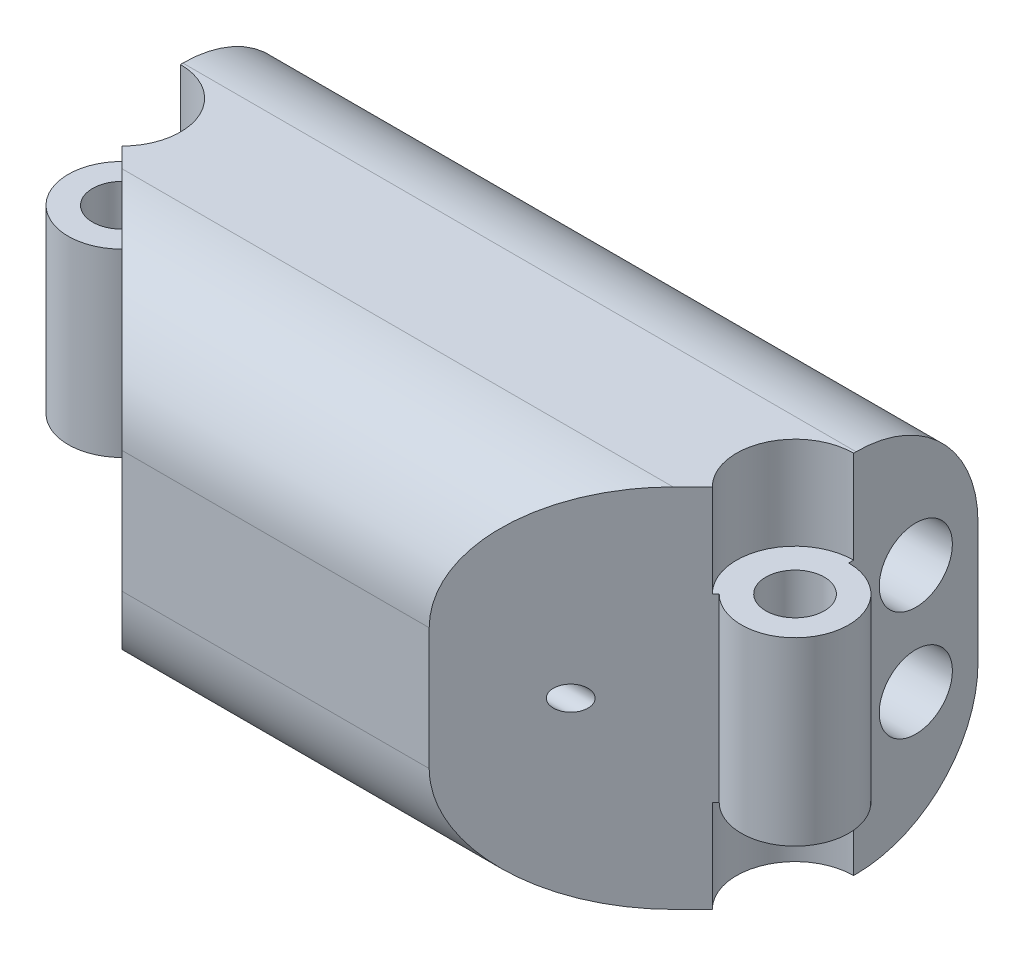
ISO-10303-21;
HEADER;
FILE_DESCRIPTION(('STEP AP214'),'2;1');
FILE_NAME('part.step','',(''),(''),'','','');
FILE_SCHEMA(('AUTOMOTIVE_DESIGN { 1 0 10303 214 1 1 1 1 }'));
ENDSEC;
DATA;
#1=APPLICATION_CONTEXT('core data for automotive mechanical design processes');
#2=APPLICATION_PROTOCOL_DEFINITION('international standard','automotive_design',2000,#1);
#3=PRODUCT_CONTEXT('',#1,'mechanical');
#4=PRODUCT('Part','Part','',(#3));
#5=PRODUCT_RELATED_PRODUCT_CATEGORY('part','',(#4));
#6=PRODUCT_DEFINITION_FORMATION('','',#4);
#7=PRODUCT_DEFINITION_CONTEXT('part definition',#1,'design');
#8=PRODUCT_DEFINITION('design','',#6,#7);
#9=PRODUCT_DEFINITION_SHAPE('','',#8);
#10=(LENGTH_UNIT() NAMED_UNIT(*) SI_UNIT(.MILLI.,.METRE.));
#11=(NAMED_UNIT(*) PLANE_ANGLE_UNIT() SI_UNIT($,.RADIAN.));
#12=(NAMED_UNIT(*) SI_UNIT($,.STERADIAN.) SOLID_ANGLE_UNIT());
#13=UNCERTAINTY_MEASURE_WITH_UNIT(LENGTH_MEASURE(1.E-05),#10,'distance_accuracy_value','');
#14=(GEOMETRIC_REPRESENTATION_CONTEXT(3) GLOBAL_UNCERTAINTY_ASSIGNED_CONTEXT((#13)) GLOBAL_UNIT_ASSIGNED_CONTEXT((#10,
#11,#12)) REPRESENTATION_CONTEXT('',''));
#15=CARTESIAN_POINT('',(0.,0.,0.));
#16=DIRECTION('',(0.,0.,1.));
#17=DIRECTION('',(1.,0.,0.));
#18=AXIS2_PLACEMENT_3D('',#15,#16,#17);
#19=CARTESIAN_POINT('',(13.8,-7.5,0.));
#20=DIRECTION('',(0.,1.,0.));
#21=DIRECTION('',(0.,0.,1.));
#22=AXIS2_PLACEMENT_3D('',#19,#20,#21);
#23=CYLINDRICAL_SURFACE('',#22,2.4);
#24=CARTESIAN_POINT('',(13.8,-3.7,0.));
#25=DIRECTION('',(0.,1.,0.));
#26=DIRECTION('',(0.,0.,1.));
#27=AXIS2_PLACEMENT_3D('',#24,#25,#26);
#28=CIRCLE('',#27,2.4);
#29=CARTESIAN_POINT('',(13.8,-3.7,-2.4));
#30=VERTEX_POINT('',#29);
#31=CARTESIAN_POINT('',(12.1029437251523,-3.7,1.69705627484771));
#32=VERTEX_POINT('',#31);
#33=EDGE_CURVE('E71',#30,#32,#28,.T.);
#34=ORIENTED_EDGE('',*,*,#33,.T.);
#35=DIRECTION('',(0.,1.,0.));
#36=VECTOR('',#35,1.);
#37=CARTESIAN_POINT('',(12.1029437251523,-7.5,1.69705627484771));
#38=LINE('',#37,#36);
#39=CARTESIAN_POINT('',(12.1029437251523,-7.5,1.69705627484771));
#40=VERTEX_POINT('',#39);
#41=EDGE_CURVE('E349',#40,#32,#38,.T.);
#42=ORIENTED_EDGE('',*,*,#41,.F.);
#43=CARTESIAN_POINT('',(13.8,-7.5,0.));
#44=DIRECTION('',(0.,1.,0.));
#45=DIRECTION('',(0.,0.,1.));
#46=AXIS2_PLACEMENT_3D('',#43,#44,#45);
#47=CIRCLE('',#46,2.4);
#48=CARTESIAN_POINT('',(13.8,-7.5,-2.4));
#49=VERTEX_POINT('',#48);
#50=EDGE_CURVE('E327',#49,#40,#47,.T.);
#51=ORIENTED_EDGE('',*,*,#50,.F.);
#52=DIRECTION('',(0.,1.,0.));
#53=VECTOR('',#52,1.);
#54=CARTESIAN_POINT('',(13.8,-7.5,-2.4));
#55=LINE('',#54,#53);
#56=EDGE_CURVE('E379',#49,#30,#55,.T.);
#57=ORIENTED_EDGE('',*,*,#56,.T.);
#58=EDGE_LOOP('',(#34,#42,#51,#57));
#59=FACE_BOUND('',#58,.T.);
#60=ADVANCED_FACE('F47',(#59),#23,.F.);
#61=CARTESIAN_POINT('',(-13.8,-7.5,0.));
#62=DIRECTION('',(0.,1.,0.));
#63=DIRECTION('',(0.,0.,1.));
#64=AXIS2_PLACEMENT_3D('',#61,#62,#63);
#65=CYLINDRICAL_SURFACE('',#64,2.4);
#66=CARTESIAN_POINT('',(-13.8,3.7,0.));
#67=DIRECTION('',(0.,1.,0.));
#68=DIRECTION('',(0.,0.,-1.));
#69=AXIS2_PLACEMENT_3D('',#66,#67,#68);
#70=CIRCLE('',#69,2.4);
#71=CARTESIAN_POINT('',(-12.1029437251523,3.7,1.69705627484772));
#72=VERTEX_POINT('',#71);
#73=CARTESIAN_POINT('',(-13.8,3.7,-2.4));
#74=VERTEX_POINT('',#73);
#75=EDGE_CURVE('E274',#72,#74,#70,.T.);
#76=ORIENTED_EDGE('',*,*,#75,.F.);
#77=DIRECTION('',(0.,1.,0.));
#78=VECTOR('',#77,1.);
#79=CARTESIAN_POINT('',(-12.1029437251523,-7.5,1.69705627484771));
#80=LINE('',#79,#78);
#81=CARTESIAN_POINT('',(-12.1029437251523,7.5,1.69705627484771));
#82=VERTEX_POINT('',#81);
#83=EDGE_CURVE('E365',#72,#82,#80,.T.);
#84=ORIENTED_EDGE('',*,*,#83,.T.);
#85=CARTESIAN_POINT('',(-13.8,7.5,0.));
#86=DIRECTION('',(0.,1.,0.));
#87=DIRECTION('',(0.,0.,1.));
#88=AXIS2_PLACEMENT_3D('',#85,#86,#87);
#89=CIRCLE('',#88,2.4);
#90=CARTESIAN_POINT('',(-13.8,7.5,-2.4));
#91=VERTEX_POINT('',#90);
#92=EDGE_CURVE('E316',#82,#91,#89,.T.);
#93=ORIENTED_EDGE('',*,*,#92,.T.);
#94=DIRECTION('',(0.,1.,0.));
#95=VECTOR('',#94,1.);
#96=CARTESIAN_POINT('',(-13.8,-7.5,-2.4));
#97=LINE('',#96,#95);
#98=EDGE_CURVE('E370',#74,#91,#97,.T.);
#99=ORIENTED_EDGE('',*,*,#98,.F.);
#100=EDGE_LOOP('',(#76,#84,#93,#99));
#101=FACE_BOUND('',#100,.T.);
#102=ADVANCED_FACE('F449',(#101),#65,.F.);
#103=CARTESIAN_POINT('',(12.1029437251523,3.7,1.69705627484771));
#104=VERTEX_POINT('',#103);
#105=CARTESIAN_POINT('',(12.1029437251523,7.5,1.69705627484771));
#106=VERTEX_POINT('',#105);
#107=EDGE_CURVE('E63',#104,#106,#38,.T.);
#108=ORIENTED_EDGE('',*,*,#107,.F.);
#109=CARTESIAN_POINT('',(13.8,3.7,0.));
#110=DIRECTION('',(0.,1.,0.));
#111=DIRECTION('',(0.,0.,1.));
#112=AXIS2_PLACEMENT_3D('',#109,#110,#111);
#113=CIRCLE('',#112,2.4);
#114=CARTESIAN_POINT('',(13.8,3.7,-2.4));
#115=VERTEX_POINT('',#114);
#116=EDGE_CURVE('E209',#115,#104,#113,.T.);
#117=ORIENTED_EDGE('',*,*,#116,.F.);
#118=CARTESIAN_POINT('',(13.8,7.5,-2.4));
#119=VERTEX_POINT('',#118);
#120=EDGE_CURVE('E348',#115,#119,#55,.T.);
#121=ORIENTED_EDGE('',*,*,#120,.T.);
#122=CARTESIAN_POINT('',(13.8,7.5,0.));
#123=DIRECTION('',(0.,1.,0.));
#124=DIRECTION('',(0.,0.,1.));
#125=AXIS2_PLACEMENT_3D('',#122,#123,#124);
#126=CIRCLE('',#125,2.4);
#127=EDGE_CURVE('E299',#119,#106,#126,.T.);
#128=ORIENTED_EDGE('',*,*,#127,.T.);
#129=EDGE_LOOP('',(#108,#117,#121,#128));
#130=FACE_BOUND('',#129,.T.);
#131=ADVANCED_FACE('F454',(#130),#23,.F.);
#132=CARTESIAN_POINT('',(6.9,-7.5,6.9));
#133=DIRECTION('',(-0.707106781186547,0.,-0.707106781186548));
#134=DIRECTION('',(-0.707106781186548,0.,0.707106781186547));
#135=AXIS2_PLACEMENT_3D('',#132,#133,#134);
#136=PLANE('',#135);
#137=CARTESIAN_POINT('',(9.20147186257615,0.,4.59852813742385));
#138=DIRECTION('',(-0.707106781186547,0.,-0.707106781186548));
#139=DIRECTION('',(-0.707106781186548,0.,0.707106781186547));
#140=AXIS2_PLACEMENT_3D('',#137,#138,#139);
#141=ELLIPSE('',#140,0.707106781186548,0.5);
#142=CARTESIAN_POINT('',(8.70147186257615,0.,5.09852813742386));
#143=VERTEX_POINT('',#142);
#144=EDGE_CURVE('E285',#143,#143,#141,.T.);
#145=ORIENTED_EDGE('',*,*,#144,.T.);
#146=EDGE_LOOP('',(#145));
#147=FACE_BOUND('',#146,.T.);
#148=DIRECTION('',(-0.707106781186548,0.,0.707106781186547));
#149=VECTOR('',#148,1.);
#150=CARTESIAN_POINT('',(6.9,7.5,6.9));
#151=LINE('',#150,#149);
#152=CARTESIAN_POINT('',(11.3,7.5,2.5));
#153=VERTEX_POINT('',#152);
#154=EDGE_CURVE('E324',#106,#153,#151,.T.);
#155=ORIENTED_EDGE('',*,*,#154,.T.);
#156=CARTESIAN_POINT('',(11.3,2.5,2.5));
#157=DIRECTION('',(-0.707106781186547,0.,-0.707106781186548));
#158=DIRECTION('',(0.707106781186548,0.,-0.707106781186547));
#159=AXIS2_PLACEMENT_3D('',#156,#157,#158);
#160=ELLIPSE('',#159,7.07106781186548,5.);
#161=CARTESIAN_POINT('',(6.3,2.5,7.5));
#162=VERTEX_POINT('',#161);
#163=EDGE_CURVE('E56',#153,#162,#160,.F.);
#164=ORIENTED_EDGE('',*,*,#163,.T.);
#165=DIRECTION('',(0.,1.,0.));
#166=VECTOR('',#165,1.);
#167=CARTESIAN_POINT('',(6.3,-7.5,7.5));
#168=LINE('',#167,#166);
#169=CARTESIAN_POINT('',(6.3,-2.5,7.5));
#170=VERTEX_POINT('',#169);
#171=EDGE_CURVE('E353',#170,#162,#168,.T.);
#172=ORIENTED_EDGE('',*,*,#171,.F.);
#173=CARTESIAN_POINT('',(11.3,-2.5,2.5));
#174=DIRECTION('',(-0.707106781186547,0.,-0.707106781186548));
#175=DIRECTION('',(-0.707106781186548,0.,0.707106781186547));
#176=AXIS2_PLACEMENT_3D('',#173,#174,#175);
#177=ELLIPSE('',#176,7.07106781186548,5.);
#178=CARTESIAN_POINT('',(11.3,-7.5,2.5));
#179=VERTEX_POINT('',#178);
#180=EDGE_CURVE('E423',#170,#179,#177,.F.);
#181=ORIENTED_EDGE('',*,*,#180,.T.);
#182=DIRECTION('',(-0.707106781186548,0.,0.707106781186547));
#183=VECTOR('',#182,1.);
#184=CARTESIAN_POINT('',(6.9,-7.5,6.9));
#185=LINE('',#184,#183);
#186=EDGE_CURVE('E344',#40,#179,#185,.T.);
#187=ORIENTED_EDGE('',*,*,#186,.F.);
#188=ORIENTED_EDGE('',*,*,#41,.T.);
#189=DIRECTION('',(0.707106781186548,0.,-0.707106781186546));
#190=VECTOR('',#189,1.);
#191=CARTESIAN_POINT('',(12.1029437251523,-3.7,1.69705627484771));
#192=LINE('',#191,#190);
#193=CARTESIAN_POINT('',(12.2443650813896,-3.7,1.5556349186104));
#194=VERTEX_POINT('',#193);
#195=EDGE_CURVE('E193',#32,#194,#192,.T.);
#196=ORIENTED_EDGE('',*,*,#195,.T.);
#197=DIRECTION('',(0.,1.,0.));
#198=VECTOR('',#197,1.);
#199=CARTESIAN_POINT('',(12.2443650813896,-3.7,1.5556349186104));
#200=LINE('',#199,#198);
#201=CARTESIAN_POINT('',(12.2443650813896,3.7,1.5556349186104));
#202=VERTEX_POINT('',#201);
#203=EDGE_CURVE('E186',#194,#202,#200,.T.);
#204=ORIENTED_EDGE('',*,*,#203,.T.);
#205=DIRECTION('',(0.707106781186548,0.,-0.707106781186546));
#206=VECTOR('',#205,1.);
#207=CARTESIAN_POINT('',(12.1029437251523,3.7,1.69705627484771));
#208=LINE('',#207,#206);
#209=EDGE_CURVE('E190',#104,#202,#208,.T.);
#210=ORIENTED_EDGE('',*,*,#209,.F.);
#211=ORIENTED_EDGE('',*,*,#107,.T.);
#212=EDGE_LOOP('',(#155,#164,#172,#181,#187,#188,#196,#204,#210,#211));
#213=FACE_BOUND('',#212,.T.);
#214=ADVANCED_FACE('F189',(#147,#213),#136,.F.);
#215=CARTESIAN_POINT('',(0.,-7.5,7.5));
#216=DIRECTION('',(0.,0.,-1.));
#217=DIRECTION('',(-1.,0.,0.));
#218=AXIS2_PLACEMENT_3D('',#215,#216,#217);
#219=PLANE('',#218);
#220=ORIENTED_EDGE('',*,*,#171,.T.);
#221=DIRECTION('',(-1.,0.,0.));
#222=VECTOR('',#221,1.);
#223=CARTESIAN_POINT('',(-6.3,2.5,7.5));
#224=LINE('',#223,#222);
#225=CARTESIAN_POINT('',(-6.3,2.5,7.5));
#226=VERTEX_POINT('',#225);
#227=EDGE_CURVE('E410',#162,#226,#224,.T.);
#228=ORIENTED_EDGE('',*,*,#227,.T.);
#229=DIRECTION('',(0.,1.,0.));
#230=VECTOR('',#229,1.);
#231=CARTESIAN_POINT('',(-6.3,-7.5,7.5));
#232=LINE('',#231,#230);
#233=CARTESIAN_POINT('',(-6.3,-2.5,7.5));
#234=VERTEX_POINT('',#233);
#235=EDGE_CURVE('E357',#234,#226,#232,.T.);
#236=ORIENTED_EDGE('',*,*,#235,.F.);
#237=DIRECTION('',(-1.,0.,0.));
#238=VECTOR('',#237,1.);
#239=CARTESIAN_POINT('',(0.,-2.5,7.5));
#240=LINE('',#239,#238);
#241=EDGE_CURVE('E407',#234,#170,#240,.F.);
#242=ORIENTED_EDGE('',*,*,#241,.T.);
#243=EDGE_LOOP('',(#220,#228,#236,#242));
#244=FACE_BOUND('',#243,.T.);
#245=ADVANCED_FACE('F434',(#244),#219,.F.);
#246=CARTESIAN_POINT('',(-6.9,-7.5,6.9));
#247=DIRECTION('',(0.707106781186547,0.,-0.707106781186548));
#248=DIRECTION('',(-0.707106781186548,0.,-0.707106781186547));
#249=AXIS2_PLACEMENT_3D('',#246,#247,#248);
#250=PLANE('',#249);
#251=CARTESIAN_POINT('',(-9.20147186257615,0.,4.59852813742385));
#252=DIRECTION('',(0.707106781186547,0.,-0.707106781186548));
#253=DIRECTION('',(0.707106781186548,0.,0.707106781186547));
#254=AXIS2_PLACEMENT_3D('',#251,#252,#253);
#255=ELLIPSE('',#254,0.707106781186548,0.5);
#256=CARTESIAN_POINT('',(-8.70147186257615,0.,5.09852813742386));
#257=VERTEX_POINT('',#256);
#258=EDGE_CURVE('E235',#257,#257,#255,.F.);
#259=ORIENTED_EDGE('',*,*,#258,.F.);
#260=EDGE_LOOP('',(#259));
#261=FACE_BOUND('',#260,.T.);
#262=ORIENTED_EDGE('',*,*,#235,.T.);
#263=CARTESIAN_POINT('',(-11.3,2.5,2.5));
#264=DIRECTION('',(0.707106781186547,0.,-0.707106781186548));
#265=DIRECTION('',(0.707106781186548,0.,0.707106781186547));
#266=AXIS2_PLACEMENT_3D('',#263,#264,#265);
#267=ELLIPSE('',#266,7.07106781186548,5.);
#268=CARTESIAN_POINT('',(-11.3,7.5,2.5));
#269=VERTEX_POINT('',#268);
#270=EDGE_CURVE('E417',#226,#269,#267,.F.);
#271=ORIENTED_EDGE('',*,*,#270,.T.);
#272=DIRECTION('',(-0.707106781186548,0.,-0.707106781186547));
#273=VECTOR('',#272,1.);
#274=CARTESIAN_POINT('',(-6.9,7.5,6.9));
#275=LINE('',#274,#273);
#276=EDGE_CURVE('E320',#269,#82,#275,.T.);
#277=ORIENTED_EDGE('',*,*,#276,.T.);
#278=ORIENTED_EDGE('',*,*,#83,.F.);
#279=DIRECTION('',(0.707106781186548,0.,0.707106781186546));
#280=VECTOR('',#279,1.);
#281=CARTESIAN_POINT('',(-12.1029437251523,3.7,1.69705627484772));
#282=LINE('',#281,#280);
#283=CARTESIAN_POINT('',(-12.2443650813896,3.7,1.55563491861041));
#284=VERTEX_POINT('',#283);
#285=EDGE_CURVE('E263',#284,#72,#282,.T.);
#286=ORIENTED_EDGE('',*,*,#285,.F.);
#287=DIRECTION('',(0.,1.,0.));
#288=VECTOR('',#287,1.);
#289=CARTESIAN_POINT('',(-12.2443650813896,-3.7,1.55563491861041));
#290=LINE('',#289,#288);
#291=CARTESIAN_POINT('',(-12.2443650813896,-3.7,1.55563491861041));
#292=VERTEX_POINT('',#291);
#293=EDGE_CURVE('E241',#292,#284,#290,.T.);
#294=ORIENTED_EDGE('',*,*,#293,.F.);
#295=DIRECTION('',(0.707106781186548,0.,0.707106781186546));
#296=VECTOR('',#295,1.);
#297=CARTESIAN_POINT('',(-12.1029437251523,-3.7,1.69705627484772));
#298=LINE('',#297,#296);
#299=CARTESIAN_POINT('',(-12.1029437251523,-3.7,1.69705627484772));
#300=VERTEX_POINT('',#299);
#301=EDGE_CURVE('E240',#292,#300,#298,.T.);
#302=ORIENTED_EDGE('',*,*,#301,.T.);
#303=CARTESIAN_POINT('',(-12.1029437251523,-7.5,1.69705627484771));
#304=VERTEX_POINT('',#303);
#305=EDGE_CURVE('E361',#304,#300,#80,.T.);
#306=ORIENTED_EDGE('',*,*,#305,.F.);
#307=DIRECTION('',(-0.707106781186548,0.,-0.707106781186547));
#308=VECTOR('',#307,1.);
#309=CARTESIAN_POINT('',(-6.9,-7.5,6.9));
#310=LINE('',#309,#308);
#311=CARTESIAN_POINT('',(-11.3,-7.5,2.5));
#312=VERTEX_POINT('',#311);
#313=EDGE_CURVE('E341',#312,#304,#310,.T.);
#314=ORIENTED_EDGE('',*,*,#313,.F.);
#315=CARTESIAN_POINT('',(-11.3,-2.5,2.5));
#316=DIRECTION('',(0.707106781186547,0.,-0.707106781186548));
#317=DIRECTION('',(-0.707106781186548,0.,-0.707106781186547));
#318=AXIS2_PLACEMENT_3D('',#315,#316,#317);
#319=ELLIPSE('',#318,7.07106781186548,5.);
#320=EDGE_CURVE('E414',#312,#234,#319,.F.);
#321=ORIENTED_EDGE('',*,*,#320,.T.);
#322=EDGE_LOOP('',(#262,#271,#277,#278,#286,#294,#302,#306,#314,#321));
#323=FACE_BOUND('',#322,.T.);
#324=ADVANCED_FACE('F440',(#261,#323),#250,.F.);
#325=ORIENTED_EDGE('',*,*,#305,.T.);
#326=CARTESIAN_POINT('',(-13.8,-3.7,0.));
#327=DIRECTION('',(0.,1.,0.));
#328=DIRECTION('',(0.,0.,-1.));
#329=AXIS2_PLACEMENT_3D('',#326,#327,#328);
#330=CIRCLE('',#329,2.4);
#331=CARTESIAN_POINT('',(-13.8,-3.7,-2.39999999999999));
#332=VERTEX_POINT('',#331);
#333=EDGE_CURVE('E255',#300,#332,#330,.T.);
#334=ORIENTED_EDGE('',*,*,#333,.T.);
#335=CARTESIAN_POINT('',(-13.8,-7.5,-2.4));
#336=VERTEX_POINT('',#335);
#337=EDGE_CURVE('E366',#336,#332,#97,.T.);
#338=ORIENTED_EDGE('',*,*,#337,.F.);
#339=CARTESIAN_POINT('',(-13.8,-7.5,0.));
#340=DIRECTION('',(0.,1.,0.));
#341=DIRECTION('',(0.,0.,1.));
#342=AXIS2_PLACEMENT_3D('',#339,#340,#341);
#343=CIRCLE('',#342,2.4);
#344=EDGE_CURVE('E338',#304,#336,#343,.T.);
#345=ORIENTED_EDGE('',*,*,#344,.F.);
#346=EDGE_LOOP('',(#325,#334,#338,#345));
#347=FACE_BOUND('',#346,.T.);
#348=ADVANCED_FACE('F484',(#347),#65,.F.);
#349=CARTESIAN_POINT('',(-13.8,-7.5,0.));
#350=DIRECTION('',(1.,0.,0.));
#351=DIRECTION('',(0.,0.,-1.));
#352=AXIS2_PLACEMENT_3D('',#349,#350,#351);
#353=PLANE('',#352);
#354=CARTESIAN_POINT('',(-13.8,-2.25,-4.95));
#355=DIRECTION('',(1.,0.,0.));
#356=DIRECTION('',(0.,0.,-1.));
#357=AXIS2_PLACEMENT_3D('',#354,#355,#356);
#358=CIRCLE('',#357,1.5);
#359=CARTESIAN_POINT('',(-13.8,-2.25,-6.45));
#360=VERTEX_POINT('',#359);
#361=EDGE_CURVE('E294',#360,#360,#358,.F.);
#362=ORIENTED_EDGE('',*,*,#361,.F.);
#363=EDGE_LOOP('',(#362));
#364=FACE_BOUND('',#363,.T.);
#365=CARTESIAN_POINT('',(-13.8,2.25,-4.95));
#366=DIRECTION('',(1.,0.,0.));
#367=DIRECTION('',(0.,0.,-1.));
#368=AXIS2_PLACEMENT_3D('',#365,#366,#367);
#369=CIRCLE('',#368,1.5);
#370=CARTESIAN_POINT('',(-13.8,2.25,-6.45));
#371=VERTEX_POINT('',#370);
#372=EDGE_CURVE('E295',#371,#371,#369,.F.);
#373=ORIENTED_EDGE('',*,*,#372,.F.);
#374=EDGE_LOOP('',(#373));
#375=FACE_BOUND('',#374,.T.);
#376=DIRECTION('',(0.,1.,0.));
#377=VECTOR('',#376,1.);
#378=CARTESIAN_POINT('',(-13.8,-7.5,-7.5));
#379=LINE('',#378,#377);
#380=CARTESIAN_POINT('',(-13.8,-2.5,-7.5));
#381=VERTEX_POINT('',#380);
#382=CARTESIAN_POINT('',(-13.8,2.5,-7.5));
#383=VERTEX_POINT('',#382);
#384=EDGE_CURVE('E371',#381,#383,#379,.T.);
#385=ORIENTED_EDGE('',*,*,#384,.F.);
#386=CARTESIAN_POINT('',(-13.8,-2.5,-2.5));
#387=DIRECTION('',(1.,0.,0.));
#388=DIRECTION('',(0.,0.,-1.));
#389=AXIS2_PLACEMENT_3D('',#386,#387,#388);
#390=CIRCLE('',#389,5.);
#391=CARTESIAN_POINT('',(-13.8,-7.5,-2.5));
#392=VERTEX_POINT('',#391);
#393=EDGE_CURVE('E401',#381,#392,#390,.F.);
#394=ORIENTED_EDGE('',*,*,#393,.T.);
#395=DIRECTION('',(0.,0.,-1.));
#396=VECTOR('',#395,1.);
#397=CARTESIAN_POINT('',(-13.8,-7.5,0.));
#398=LINE('',#397,#396);
#399=EDGE_CURVE('E334',#336,#392,#398,.T.);
#400=ORIENTED_EDGE('',*,*,#399,.F.);
#401=ORIENTED_EDGE('',*,*,#337,.T.);
#402=DIRECTION('',(0.,0.,1.));
#403=VECTOR('',#402,1.);
#404=CARTESIAN_POINT('',(-13.8,-3.7,-2.39999999999999));
#405=LINE('',#404,#403);
#406=CARTESIAN_POINT('',(-13.8,-3.7,-2.19999999999999));
#407=VERTEX_POINT('',#406);
#408=EDGE_CURVE('E251',#332,#407,#405,.T.);
#409=ORIENTED_EDGE('',*,*,#408,.T.);
#410=DIRECTION('',(0.,1.,0.));
#411=VECTOR('',#410,1.);
#412=CARTESIAN_POINT('',(-13.8,-3.7,-2.19999999999999));
#413=LINE('',#412,#411);
#414=CARTESIAN_POINT('',(-13.8,3.7,-2.19999999999999));
#415=VERTEX_POINT('',#414);
#416=EDGE_CURVE('E237',#407,#415,#413,.T.);
#417=ORIENTED_EDGE('',*,*,#416,.T.);
#418=DIRECTION('',(0.,0.,1.));
#419=VECTOR('',#418,1.);
#420=CARTESIAN_POINT('',(-13.8,3.7,-2.39999999999999));
#421=LINE('',#420,#419);
#422=EDGE_CURVE('E270',#74,#415,#421,.T.);
#423=ORIENTED_EDGE('',*,*,#422,.F.);
#424=ORIENTED_EDGE('',*,*,#98,.T.);
#425=DIRECTION('',(0.,0.,-1.));
#426=VECTOR('',#425,1.);
#427=CARTESIAN_POINT('',(-13.8,7.5,0.));
#428=LINE('',#427,#426);
#429=CARTESIAN_POINT('',(-13.8,7.5,-2.5));
#430=VERTEX_POINT('',#429);
#431=EDGE_CURVE('E312',#91,#430,#428,.T.);
#432=ORIENTED_EDGE('',*,*,#431,.T.);
#433=CARTESIAN_POINT('',(-13.8,2.5,-2.5));
#434=DIRECTION('',(1.,0.,0.));
#435=DIRECTION('',(0.,0.,-1.));
#436=AXIS2_PLACEMENT_3D('',#433,#434,#435);
#437=CIRCLE('',#436,5.);
#438=EDGE_CURVE('E398',#430,#383,#437,.F.);
#439=ORIENTED_EDGE('',*,*,#438,.T.);
#440=EDGE_LOOP('',(#385,#394,#400,#401,#409,#417,#423,#424,#432,#439));
#441=FACE_BOUND('',#440,.T.);
#442=ADVANCED_FACE('F467',(#364,#375,#441),#353,.F.);
#443=CARTESIAN_POINT('',(0.,-7.5,-7.5));
#444=DIRECTION('',(0.,0.,1.));
#445=DIRECTION('',(1.,0.,0.));
#446=AXIS2_PLACEMENT_3D('',#443,#444,#445);
#447=PLANE('',#446);
#448=DIRECTION('',(0.,1.,0.));
#449=VECTOR('',#448,1.);
#450=CARTESIAN_POINT('',(13.8,-7.5,-7.5));
#451=LINE('',#450,#449);
#452=CARTESIAN_POINT('',(13.8,-2.5,-7.5));
#453=VERTEX_POINT('',#452);
#454=CARTESIAN_POINT('',(13.8,2.5,-7.5));
#455=VERTEX_POINT('',#454);
#456=EDGE_CURVE('E375',#453,#455,#451,.T.);
#457=ORIENTED_EDGE('',*,*,#456,.F.);
#458=DIRECTION('',(1.,0.,0.));
#459=VECTOR('',#458,1.);
#460=CARTESIAN_POINT('',(0.,-2.5,-7.5));
#461=LINE('',#460,#459);
#462=EDGE_CURVE('E395',#453,#381,#461,.F.);
#463=ORIENTED_EDGE('',*,*,#462,.T.);
#464=ORIENTED_EDGE('',*,*,#384,.T.);
#465=DIRECTION('',(1.,0.,0.));
#466=VECTOR('',#465,1.);
#467=CARTESIAN_POINT('',(13.8,2.5,-7.5));
#468=LINE('',#467,#466);
#469=EDGE_CURVE('E391',#383,#455,#468,.T.);
#470=ORIENTED_EDGE('',*,*,#469,.T.);
#471=EDGE_LOOP('',(#457,#463,#464,#470));
#472=FACE_BOUND('',#471,.T.);
#473=ADVANCED_FACE('F471',(#472),#447,.F.);
#474=CARTESIAN_POINT('',(13.8,-7.5,0.));
#475=DIRECTION('',(-1.,0.,0.));
#476=DIRECTION('',(0.,0.,1.));
#477=AXIS2_PLACEMENT_3D('',#474,#475,#476);
#478=PLANE('',#477);
#479=CARTESIAN_POINT('',(13.8,-2.25,-4.95));
#480=DIRECTION('',(1.,0.,0.));
#481=DIRECTION('',(0.,0.,-1.));
#482=AXIS2_PLACEMENT_3D('',#479,#480,#481);
#483=CIRCLE('',#482,1.5);
#484=CARTESIAN_POINT('',(13.8,-2.25,-6.45));
#485=VERTEX_POINT('',#484);
#486=EDGE_CURVE('E290',#485,#485,#483,.T.);
#487=ORIENTED_EDGE('',*,*,#486,.F.);
#488=EDGE_LOOP('',(#487));
#489=FACE_BOUND('',#488,.T.);
#490=CARTESIAN_POINT('',(13.8,2.25,-4.95));
#491=DIRECTION('',(1.,0.,0.));
#492=DIRECTION('',(0.,0.,-1.));
#493=AXIS2_PLACEMENT_3D('',#490,#491,#492);
#494=CIRCLE('',#493,1.5);
#495=CARTESIAN_POINT('',(13.8,2.25,-6.45));
#496=VERTEX_POINT('',#495);
#497=EDGE_CURVE('E289',#496,#496,#494,.T.);
#498=ORIENTED_EDGE('',*,*,#497,.F.);
#499=EDGE_LOOP('',(#498));
#500=FACE_BOUND('',#499,.T.);
#501=DIRECTION('',(0.,0.,1.));
#502=VECTOR('',#501,1.);
#503=CARTESIAN_POINT('',(13.8,-7.5,0.));
#504=LINE('',#503,#502);
#505=CARTESIAN_POINT('',(13.8,-7.5,-2.5));
#506=VERTEX_POINT('',#505);
#507=EDGE_CURVE('E331',#506,#49,#504,.T.);
#508=ORIENTED_EDGE('',*,*,#507,.F.);
#509=CARTESIAN_POINT('',(13.8,-2.5,-2.5));
#510=DIRECTION('',(-1.,0.,0.));
#511=DIRECTION('',(0.,0.,1.));
#512=AXIS2_PLACEMENT_3D('',#509,#510,#511);
#513=CIRCLE('',#512,5.);
#514=EDGE_CURVE('E388',#506,#453,#513,.F.);
#515=ORIENTED_EDGE('',*,*,#514,.T.);
#516=ORIENTED_EDGE('',*,*,#456,.T.);
#517=CARTESIAN_POINT('',(13.8,2.5,-2.5));
#518=DIRECTION('',(-1.,0.,0.));
#519=DIRECTION('',(0.,0.,1.));
#520=AXIS2_PLACEMENT_3D('',#517,#518,#519);
#521=CIRCLE('',#520,5.);
#522=CARTESIAN_POINT('',(13.8,7.5,-2.5));
#523=VERTEX_POINT('',#522);
#524=EDGE_CURVE('E385',#455,#523,#521,.F.);
#525=ORIENTED_EDGE('',*,*,#524,.T.);
#526=DIRECTION('',(0.,0.,1.));
#527=VECTOR('',#526,1.);
#528=CARTESIAN_POINT('',(13.8,7.5,0.));
#529=LINE('',#528,#527);
#530=EDGE_CURVE('E308',#523,#119,#529,.T.);
#531=ORIENTED_EDGE('',*,*,#530,.T.);
#532=ORIENTED_EDGE('',*,*,#120,.F.);
#533=DIRECTION('',(0.,0.,-1.));
#534=VECTOR('',#533,1.);
#535=CARTESIAN_POINT('',(13.8,3.7,-2.4));
#536=LINE('',#535,#534);
#537=CARTESIAN_POINT('',(13.8,3.7,-2.2));
#538=VERTEX_POINT('',#537);
#539=EDGE_CURVE('E214',#538,#115,#536,.T.);
#540=ORIENTED_EDGE('',*,*,#539,.F.);
#541=DIRECTION('',(0.,1.,0.));
#542=VECTOR('',#541,1.);
#543=CARTESIAN_POINT('',(13.8,-3.7,-2.2));
#544=LINE('',#543,#542);
#545=CARTESIAN_POINT('',(13.8,-3.7,-2.2));
#546=VERTEX_POINT('',#545);
#547=EDGE_CURVE('E199',#546,#538,#544,.T.);
#548=ORIENTED_EDGE('',*,*,#547,.F.);
#549=DIRECTION('',(0.,0.,-1.));
#550=VECTOR('',#549,1.);
#551=CARTESIAN_POINT('',(13.8,-3.7,-2.4));
#552=LINE('',#551,#550);
#553=EDGE_CURVE('E200',#546,#30,#552,.T.);
#554=ORIENTED_EDGE('',*,*,#553,.T.);
#555=ORIENTED_EDGE('',*,*,#56,.F.);
#556=EDGE_LOOP('',(#508,#515,#516,#525,#531,#532,#540,#548,#554,#555));
#557=FACE_BOUND('',#556,.T.);
#558=ADVANCED_FACE('F459',(#489,#500,#557),#478,.F.);
#559=CARTESIAN_POINT('',(0.,-7.5,0.));
#560=DIRECTION('',(0.,1.,0.));
#561=DIRECTION('',(0.,0.,1.));
#562=AXIS2_PLACEMENT_3D('',#559,#560,#561);
#563=PLANE('',#562);
#564=ORIENTED_EDGE('',*,*,#186,.T.);
#565=DIRECTION('',(-1.,0.,0.));
#566=VECTOR('',#565,1.);
#567=CARTESIAN_POINT('',(0.,-7.5,2.5));
#568=LINE('',#567,#566);
#569=EDGE_CURVE('E11',#179,#312,#568,.T.);
#570=ORIENTED_EDGE('',*,*,#569,.T.);
#571=ORIENTED_EDGE('',*,*,#313,.T.);
#572=ORIENTED_EDGE('',*,*,#344,.T.);
#573=ORIENTED_EDGE('',*,*,#399,.T.);
#574=DIRECTION('',(1.,0.,0.));
#575=VECTOR('',#574,1.);
#576=CARTESIAN_POINT('',(0.,-7.5,-2.5));
#577=LINE('',#576,#575);
#578=EDGE_CURVE('E352',#392,#506,#577,.T.);
#579=ORIENTED_EDGE('',*,*,#578,.T.);
#580=ORIENTED_EDGE('',*,*,#507,.T.);
#581=ORIENTED_EDGE('',*,*,#50,.T.);
#582=EDGE_LOOP('',(#564,#570,#571,#572,#573,#579,#580,#581));
#583=FACE_BOUND('',#582,.T.);
#584=ADVANCED_FACE('F478',(#583),#563,.F.);
#585=CARTESIAN_POINT('',(0.,7.5,0.));
#586=DIRECTION('',(0.,1.,0.));
#587=DIRECTION('',(0.,0.,1.));
#588=AXIS2_PLACEMENT_3D('',#585,#586,#587);
#589=PLANE('',#588);
#590=ORIENTED_EDGE('',*,*,#276,.F.);
#591=DIRECTION('',(-1.,0.,0.));
#592=VECTOR('',#591,1.);
#593=CARTESIAN_POINT('',(6.3,7.5,2.5));
#594=LINE('',#593,#592);
#595=EDGE_CURVE('E420',#269,#153,#594,.F.);
#596=ORIENTED_EDGE('',*,*,#595,.T.);
#597=ORIENTED_EDGE('',*,*,#154,.F.);
#598=ORIENTED_EDGE('',*,*,#127,.F.);
#599=ORIENTED_EDGE('',*,*,#530,.F.);
#600=DIRECTION('',(1.,0.,0.));
#601=VECTOR('',#600,1.);
#602=CARTESIAN_POINT('',(-13.8,7.5,-2.5));
#603=LINE('',#602,#601);
#604=EDGE_CURVE('E404',#523,#430,#603,.F.);
#605=ORIENTED_EDGE('',*,*,#604,.T.);
#606=ORIENTED_EDGE('',*,*,#431,.F.);
#607=ORIENTED_EDGE('',*,*,#92,.F.);
#608=EDGE_LOOP('',(#590,#596,#597,#598,#599,#605,#606,#607));
#609=FACE_BOUND('',#608,.T.);
#610=ADVANCED_FACE('F444',(#609),#589,.T.);
#611=CARTESIAN_POINT('',(-13.801,2.25,-4.95));
#612=DIRECTION('',(1.,0.,0.));
#613=DIRECTION('',(0.,0.,-1.));
#614=AXIS2_PLACEMENT_3D('',#611,#612,#613);
#615=CYLINDRICAL_SURFACE('',#614,1.5);
#616=CARTESIAN_POINT('',(13.8,2.25,-6.45));
#617=CARTESIAN_POINT('',(13.5125,2.25,-6.45));
#618=CARTESIAN_POINT('',(13.225,2.25,-6.45));
#619=CARTESIAN_POINT('',(12.65,2.25,-6.45));
#620=CARTESIAN_POINT('',(12.3625,2.25,-6.45));
#621=CARTESIAN_POINT('',(11.7875,2.25,-6.45));
#622=CARTESIAN_POINT('',(11.5,2.25,-6.45));
#623=CARTESIAN_POINT('',(10.925,2.25,-6.45));
#624=CARTESIAN_POINT('',(10.6375,2.25,-6.45));
#625=CARTESIAN_POINT('',(10.0625,2.25,-6.45));
#626=CARTESIAN_POINT('',(9.775,2.25,-6.45));
#627=CARTESIAN_POINT('',(9.2,2.25,-6.45));
#628=CARTESIAN_POINT('',(8.9125,2.25,-6.45));
#629=CARTESIAN_POINT('',(8.3375,2.25,-6.45));
#630=CARTESIAN_POINT('',(8.05,2.25,-6.45));
#631=CARTESIAN_POINT('',(7.475,2.25,-6.45));
#632=CARTESIAN_POINT('',(7.1875,2.25,-6.45));
#633=CARTESIAN_POINT('',(6.6125,2.25,-6.45));
#634=CARTESIAN_POINT('',(6.32499999999999,2.25,-6.45));
#635=CARTESIAN_POINT('',(5.74999999999999,2.25,-6.45));
#636=CARTESIAN_POINT('',(5.4625,2.25,-6.45));
#637=CARTESIAN_POINT('',(4.88749999999999,2.25,-6.45));
#638=CARTESIAN_POINT('',(4.59999999999999,2.25,-6.45));
#639=CARTESIAN_POINT('',(4.02499999999999,2.25,-6.45));
#640=CARTESIAN_POINT('',(3.73749999999999,2.25,-6.45));
#641=CARTESIAN_POINT('',(3.1625,2.25,-6.45));
#642=CARTESIAN_POINT('',(2.875,2.25,-6.45));
#643=CARTESIAN_POINT('',(2.3,2.25,-6.45));
#644=CARTESIAN_POINT('',(2.0125,2.25,-6.45));
#645=CARTESIAN_POINT('',(1.4375,2.25,-6.45));
#646=CARTESIAN_POINT('',(1.15,2.25,-6.45));
#647=CARTESIAN_POINT('',(0.574999999999997,2.25,-6.45));
#648=CARTESIAN_POINT('',(0.287499999999997,2.25,-6.45));
#649=CARTESIAN_POINT('',(-0.287500000000004,2.25,-6.45));
#650=CARTESIAN_POINT('',(-0.575000000000004,2.25,-6.45));
#651=CARTESIAN_POINT('',(-1.15,2.25,-6.45));
#652=CARTESIAN_POINT('',(-1.4375,2.25,-6.45));
#653=CARTESIAN_POINT('',(-2.0125,2.25,-6.45));
#654=CARTESIAN_POINT('',(-2.3,2.25,-6.45));
#655=CARTESIAN_POINT('',(-2.875,2.25,-6.45));
#656=CARTESIAN_POINT('',(-3.1625,2.25,-6.45));
#657=CARTESIAN_POINT('',(-3.7375,2.25,-6.45));
#658=CARTESIAN_POINT('',(-4.025,2.25,-6.45));
#659=CARTESIAN_POINT('',(-4.6,2.25,-6.45));
#660=CARTESIAN_POINT('',(-4.8875,2.25,-6.45));
#661=CARTESIAN_POINT('',(-5.4625,2.25,-6.45));
#662=CARTESIAN_POINT('',(-5.75,2.25,-6.45));
#663=CARTESIAN_POINT('',(-6.325,2.25,-6.45));
#664=CARTESIAN_POINT('',(-6.6125,2.25,-6.45));
#665=CARTESIAN_POINT('',(-7.1875,2.25,-6.45));
#666=CARTESIAN_POINT('',(-7.475,2.25,-6.45));
#667=CARTESIAN_POINT('',(-8.05,2.25,-6.45));
#668=CARTESIAN_POINT('',(-8.3375,2.25,-6.45));
#669=CARTESIAN_POINT('',(-8.9125,2.25,-6.45));
#670=CARTESIAN_POINT('',(-9.2,2.25,-6.45));
#671=CARTESIAN_POINT('',(-9.775,2.25,-6.45));
#672=CARTESIAN_POINT('',(-10.0625,2.25,-6.45));
#673=CARTESIAN_POINT('',(-10.6375,2.25,-6.45));
#674=CARTESIAN_POINT('',(-10.925,2.25,-6.45));
#675=CARTESIAN_POINT('',(-11.5,2.25,-6.45));
#676=CARTESIAN_POINT('',(-11.7875,2.25,-6.45));
#677=CARTESIAN_POINT('',(-12.3625,2.25,-6.45));
#678=CARTESIAN_POINT('',(-12.65,2.25,-6.45));
#679=CARTESIAN_POINT('',(-13.225,2.25,-6.45));
#680=CARTESIAN_POINT('',(-13.5125,2.25,-6.45));
#681=CARTESIAN_POINT('',(-13.8,2.25,-6.45));
#682=B_SPLINE_CURVE_WITH_KNOTS('',3,(#616,#617,#618,#619,#620,#621,#622,#623,#624,#625,#626,
#627,#628,#629,#630,#631,#632,#633,#634,#635,#636,#637,#638,#639,#640,#641,#642,#643,#644,#645,
#646,#647,#648,#649,#650,#651,#652,#653,#654,#655,#656,#657,#658,#659,#660,#661,#662,#663,#664,
#665,#666,#667,#668,#669,#670,#671,#672,#673,#674,#675,#676,#677,#678,#679,#680,#681),
.UNSPECIFIED.,.F.,.F.,(4,2,2,2,2,2,2,2,2,2,2,2,2,2,2,2,2,2,2,2,2,2,2,2,2,2,2,2,2,2,2,2,4),(0.,
0.862499999999999,1.725,2.5875,3.45,4.3125,5.175,6.0375,6.9,7.7625,8.625,9.4875,10.35,11.2125,
12.075,12.9375,13.8,14.6625,15.525,16.3875,17.25,18.1125,18.975,19.8375,20.7,21.5625,22.425,
23.2875,24.15,25.0125,25.875,26.7375,27.6),.UNSPECIFIED.);
#683=EDGE_CURVE('BSEAM553',#496,#371,#682,.T.);
#684=ORIENTED_EDGE('',*,*,#497,.T.);
#685=ORIENTED_EDGE('',*,*,#372,.T.);
#686=ORIENTED_EDGE('',*,*,#683,.T.);
#687=ORIENTED_EDGE('',*,*,#683,.F.);
#688=EDGE_LOOP('',(#684,#686,#685,#687));
#689=FACE_BOUND('',#688,.T.);
#690=ADVANCED_FACE('F553',(#689),#615,.F.);
#691=CARTESIAN_POINT('',(-13.801,-2.25,-4.95));
#692=DIRECTION('',(1.,0.,0.));
#693=DIRECTION('',(0.,0.,-1.));
#694=AXIS2_PLACEMENT_3D('',#691,#692,#693);
#695=CYLINDRICAL_SURFACE('',#694,1.5);
#696=CARTESIAN_POINT('',(13.8,-2.25,-6.45));
#697=CARTESIAN_POINT('',(13.5125,-2.25,-6.45));
#698=CARTESIAN_POINT('',(13.225,-2.25,-6.45));
#699=CARTESIAN_POINT('',(12.65,-2.25,-6.45));
#700=CARTESIAN_POINT('',(12.3625,-2.25,-6.45));
#701=CARTESIAN_POINT('',(11.7875,-2.25,-6.45));
#702=CARTESIAN_POINT('',(11.5,-2.25,-6.45));
#703=CARTESIAN_POINT('',(10.925,-2.25,-6.45));
#704=CARTESIAN_POINT('',(10.6375,-2.25,-6.45));
#705=CARTESIAN_POINT('',(10.0625,-2.25,-6.45));
#706=CARTESIAN_POINT('',(9.775,-2.25,-6.45));
#707=CARTESIAN_POINT('',(9.2,-2.25,-6.45));
#708=CARTESIAN_POINT('',(8.9125,-2.25,-6.45));
#709=CARTESIAN_POINT('',(8.3375,-2.25,-6.45));
#710=CARTESIAN_POINT('',(8.05,-2.25,-6.45));
#711=CARTESIAN_POINT('',(7.475,-2.25,-6.45));
#712=CARTESIAN_POINT('',(7.1875,-2.25,-6.45));
#713=CARTESIAN_POINT('',(6.6125,-2.25,-6.45));
#714=CARTESIAN_POINT('',(6.32499999999999,-2.25,-6.45));
#715=CARTESIAN_POINT('',(5.74999999999999,-2.25,-6.45));
#716=CARTESIAN_POINT('',(5.4625,-2.25,-6.45));
#717=CARTESIAN_POINT('',(4.88749999999999,-2.25,-6.45));
#718=CARTESIAN_POINT('',(4.59999999999999,-2.25,-6.45));
#719=CARTESIAN_POINT('',(4.02499999999999,-2.25,-6.45));
#720=CARTESIAN_POINT('',(3.73749999999999,-2.25,-6.45));
#721=CARTESIAN_POINT('',(3.1625,-2.25,-6.45));
#722=CARTESIAN_POINT('',(2.875,-2.25,-6.45));
#723=CARTESIAN_POINT('',(2.3,-2.25,-6.45));
#724=CARTESIAN_POINT('',(2.0125,-2.25,-6.45));
#725=CARTESIAN_POINT('',(1.4375,-2.25,-6.45));
#726=CARTESIAN_POINT('',(1.15,-2.25,-6.45));
#727=CARTESIAN_POINT('',(0.574999999999997,-2.25,-6.45));
#728=CARTESIAN_POINT('',(0.287499999999997,-2.25,-6.45));
#729=CARTESIAN_POINT('',(-0.287500000000004,-2.25,-6.45));
#730=CARTESIAN_POINT('',(-0.575000000000004,-2.25,-6.45));
#731=CARTESIAN_POINT('',(-1.15,-2.25,-6.45));
#732=CARTESIAN_POINT('',(-1.4375,-2.25,-6.45));
#733=CARTESIAN_POINT('',(-2.0125,-2.25,-6.45));
#734=CARTESIAN_POINT('',(-2.3,-2.25,-6.45));
#735=CARTESIAN_POINT('',(-2.875,-2.25,-6.45));
#736=CARTESIAN_POINT('',(-3.1625,-2.25,-6.45));
#737=CARTESIAN_POINT('',(-3.7375,-2.25,-6.45));
#738=CARTESIAN_POINT('',(-4.025,-2.25,-6.45));
#739=CARTESIAN_POINT('',(-4.6,-2.25,-6.45));
#740=CARTESIAN_POINT('',(-4.8875,-2.25,-6.45));
#741=CARTESIAN_POINT('',(-5.4625,-2.25,-6.45));
#742=CARTESIAN_POINT('',(-5.75,-2.25,-6.45));
#743=CARTESIAN_POINT('',(-6.325,-2.25,-6.45));
#744=CARTESIAN_POINT('',(-6.6125,-2.25,-6.45));
#745=CARTESIAN_POINT('',(-7.1875,-2.25,-6.45));
#746=CARTESIAN_POINT('',(-7.475,-2.25,-6.45));
#747=CARTESIAN_POINT('',(-8.05,-2.25,-6.45));
#748=CARTESIAN_POINT('',(-8.3375,-2.25,-6.45));
#749=CARTESIAN_POINT('',(-8.9125,-2.25,-6.45));
#750=CARTESIAN_POINT('',(-9.2,-2.25,-6.45));
#751=CARTESIAN_POINT('',(-9.775,-2.25,-6.45));
#752=CARTESIAN_POINT('',(-10.0625,-2.25,-6.45));
#753=CARTESIAN_POINT('',(-10.6375,-2.25,-6.45));
#754=CARTESIAN_POINT('',(-10.925,-2.25,-6.45));
#755=CARTESIAN_POINT('',(-11.5,-2.25,-6.45));
#756=CARTESIAN_POINT('',(-11.7875,-2.25,-6.45));
#757=CARTESIAN_POINT('',(-12.3625,-2.25,-6.45));
#758=CARTESIAN_POINT('',(-12.65,-2.25,-6.45));
#759=CARTESIAN_POINT('',(-13.225,-2.25,-6.45));
#760=CARTESIAN_POINT('',(-13.5125,-2.25,-6.45));
#761=CARTESIAN_POINT('',(-13.8,-2.25,-6.45));
#762=B_SPLINE_CURVE_WITH_KNOTS('',3,(#696,#697,#698,#699,#700,#701,#702,#703,#704,#705,#706,
#707,#708,#709,#710,#711,#712,#713,#714,#715,#716,#717,#718,#719,#720,#721,#722,#723,#724,#725,
#726,#727,#728,#729,#730,#731,#732,#733,#734,#735,#736,#737,#738,#739,#740,#741,#742,#743,#744,
#745,#746,#747,#748,#749,#750,#751,#752,#753,#754,#755,#756,#757,#758,#759,#760,#761),
.UNSPECIFIED.,.F.,.F.,(4,2,2,2,2,2,2,2,2,2,2,2,2,2,2,2,2,2,2,2,2,2,2,2,2,2,2,2,2,2,2,2,4),(0.,
0.862499999999999,1.725,2.5875,3.45,4.3125,5.175,6.0375,6.9,7.7625,8.625,9.4875,10.35,11.2125,
12.075,12.9375,13.8,14.6625,15.525,16.3875,17.25,18.1125,18.975,19.8375,20.7,21.5625,22.425,
23.2875,24.15,25.0125,25.875,26.7375,27.6),.UNSPECIFIED.);
#763=EDGE_CURVE('BSEAM556',#485,#360,#762,.T.);
#764=ORIENTED_EDGE('',*,*,#486,.T.);
#765=ORIENTED_EDGE('',*,*,#361,.T.);
#766=ORIENTED_EDGE('',*,*,#763,.T.);
#767=ORIENTED_EDGE('',*,*,#763,.F.);
#768=EDGE_LOOP('',(#764,#766,#765,#767));
#769=FACE_BOUND('',#768,.T.);
#770=ADVANCED_FACE('F556',(#769),#695,.F.);
#771=CARTESIAN_POINT('',(0.,-2.5,-2.5));
#772=DIRECTION('',(1.,0.,0.));
#773=DIRECTION('',(0.,0.,-1.));
#774=AXIS2_PLACEMENT_3D('',#771,#772,#773);
#775=CYLINDRICAL_SURFACE('',#774,5.);
#776=ORIENTED_EDGE('',*,*,#393,.F.);
#777=ORIENTED_EDGE('',*,*,#462,.F.);
#778=ORIENTED_EDGE('',*,*,#514,.F.);
#779=ORIENTED_EDGE('',*,*,#578,.F.);
#780=EDGE_LOOP('',(#776,#777,#778,#779));
#781=FACE_BOUND('',#780,.T.);
#782=ADVANCED_FACE('F474',(#781),#775,.T.);
#783=CARTESIAN_POINT('',(0.,2.5,-2.5));
#784=DIRECTION('',(-1.,0.,0.));
#785=DIRECTION('',(0.,0.,1.));
#786=AXIS2_PLACEMENT_3D('',#783,#784,#785);
#787=CYLINDRICAL_SURFACE('',#786,5.);
#788=ORIENTED_EDGE('',*,*,#438,.F.);
#789=ORIENTED_EDGE('',*,*,#604,.F.);
#790=ORIENTED_EDGE('',*,*,#524,.F.);
#791=ORIENTED_EDGE('',*,*,#469,.F.);
#792=EDGE_LOOP('',(#788,#789,#790,#791));
#793=FACE_BOUND('',#792,.T.);
#794=ADVANCED_FACE('F463',(#793),#787,.T.);
#795=CARTESIAN_POINT('',(13.801,0.,4.59852813742385));
#796=DIRECTION('',(-1.,0.,0.));
#797=DIRECTION('',(0.,0.,1.));
#798=AXIS2_PLACEMENT_3D('',#795,#796,#797);
#799=CYLINDRICAL_SURFACE('',#798,0.5);
#800=ORIENTED_EDGE('',*,*,#144,.F.);
#801=EDGE_LOOP('',(#800));
#802=FACE_BOUND('',#801,.T.);
#803=ORIENTED_EDGE('',*,*,#258,.T.);
#804=EDGE_LOOP('',(#803));
#805=FACE_BOUND('',#804,.T.);
#806=ADVANCED_FACE('F567',(#802,#805),#799,.F.);
#807=CARTESIAN_POINT('',(0.,2.5,2.5));
#808=DIRECTION('',(1.,0.,0.));
#809=DIRECTION('',(0.,0.,-1.));
#810=AXIS2_PLACEMENT_3D('',#807,#808,#809);
#811=CYLINDRICAL_SURFACE('',#810,5.);
#812=ORIENTED_EDGE('',*,*,#163,.F.);
#813=ORIENTED_EDGE('',*,*,#595,.F.);
#814=ORIENTED_EDGE('',*,*,#270,.F.);
#815=ORIENTED_EDGE('',*,*,#227,.F.);
#816=EDGE_LOOP('',(#812,#813,#814,#815));
#817=FACE_BOUND('',#816,.T.);
#818=ADVANCED_FACE('F437',(#817),#811,.T.);
#819=CARTESIAN_POINT('',(0.,-2.5,2.5));
#820=DIRECTION('',(-1.,0.,0.));
#821=DIRECTION('',(0.,0.,1.));
#822=AXIS2_PLACEMENT_3D('',#819,#820,#821);
#823=CYLINDRICAL_SURFACE('',#822,5.);
#824=ORIENTED_EDGE('',*,*,#180,.F.);
#825=ORIENTED_EDGE('',*,*,#241,.F.);
#826=ORIENTED_EDGE('',*,*,#320,.F.);
#827=ORIENTED_EDGE('',*,*,#569,.F.);
#828=EDGE_LOOP('',(#824,#825,#826,#827));
#829=FACE_BOUND('',#828,.T.);
#830=ADVANCED_FACE('F49',(#829),#823,.T.);
#831=CARTESIAN_POINT('',(13.8,-3.7,0.));
#832=DIRECTION('',(0.,1.,0.));
#833=DIRECTION('',(0.,0.,1.));
#834=AXIS2_PLACEMENT_3D('',#831,#832,#833);
#835=CYLINDRICAL_SURFACE('',#834,2.2);
#836=ORIENTED_EDGE('',*,*,#547,.T.);
#837=CARTESIAN_POINT('',(13.8,3.7,0.));
#838=DIRECTION('',(0.,1.,0.));
#839=DIRECTION('',(0.,0.,1.));
#840=AXIS2_PLACEMENT_3D('',#837,#838,#839);
#841=CIRCLE('',#840,2.2);
#842=EDGE_CURVE('E207',#202,#538,#841,.T.);
#843=ORIENTED_EDGE('',*,*,#842,.F.);
#844=ORIENTED_EDGE('',*,*,#203,.F.);
#845=CARTESIAN_POINT('',(13.8,-3.7,0.));
#846=DIRECTION('',(0.,1.,0.));
#847=DIRECTION('',(0.,0.,1.));
#848=AXIS2_PLACEMENT_3D('',#845,#846,#847);
#849=CIRCLE('',#848,2.2);
#850=EDGE_CURVE('E228',#194,#546,#849,.T.);
#851=ORIENTED_EDGE('',*,*,#850,.T.);
#852=EDGE_LOOP('',(#836,#843,#844,#851));
#853=FACE_BOUND('',#852,.T.);
#854=ADVANCED_FACE('F212',(#853),#835,.T.);
#855=CARTESIAN_POINT('',(13.8,-3.7,0.));
#856=DIRECTION('',(0.,1.,0.));
#857=DIRECTION('',(0.,0.,1.));
#858=AXIS2_PLACEMENT_3D('',#855,#856,#857);
#859=PLANE('',#858);
#860=CARTESIAN_POINT('',(13.8,-3.7,0.));
#861=DIRECTION('',(0.,1.,0.));
#862=DIRECTION('',(0.,0.,1.));
#863=AXIS2_PLACEMENT_3D('',#860,#861,#862);
#864=CIRCLE('',#863,1.2);
#865=CARTESIAN_POINT('',(13.8,-3.7,1.2));
#866=VERTEX_POINT('',#865);
#867=EDGE_CURVE('E217',#866,#866,#864,.T.);
#868=ORIENTED_EDGE('',*,*,#867,.T.);
#869=EDGE_LOOP('',(#868));
#870=FACE_BOUND('',#869,.T.);
#871=ORIENTED_EDGE('',*,*,#33,.F.);
#872=ORIENTED_EDGE('',*,*,#553,.F.);
#873=ORIENTED_EDGE('',*,*,#850,.F.);
#874=ORIENTED_EDGE('',*,*,#195,.F.);
#875=EDGE_LOOP('',(#871,#872,#873,#874));
#876=FACE_BOUND('',#875,.T.);
#877=ADVANCED_FACE('F501',(#870,#876),#859,.F.);
#878=CARTESIAN_POINT('',(13.8,-3.7,0.));
#879=DIRECTION('',(0.,1.,0.));
#880=DIRECTION('',(0.,0.,1.));
#881=AXIS2_PLACEMENT_3D('',#878,#879,#880);
#882=CYLINDRICAL_SURFACE('',#881,1.2);
#883=ORIENTED_EDGE('',*,*,#867,.F.);
#884=EDGE_LOOP('',(#883));
#885=FACE_BOUND('',#884,.T.);
#886=CARTESIAN_POINT('',(13.8,3.7,0.));
#887=DIRECTION('',(0.,1.,0.));
#888=DIRECTION('',(0.,0.,1.));
#889=AXIS2_PLACEMENT_3D('',#886,#887,#888);
#890=CIRCLE('',#889,1.2);
#891=CARTESIAN_POINT('',(13.8,3.7,1.2));
#892=VERTEX_POINT('',#891);
#893=EDGE_CURVE('E281',#892,#892,#890,.T.);
#894=ORIENTED_EDGE('',*,*,#893,.T.);
#895=EDGE_LOOP('',(#894));
#896=FACE_BOUND('',#895,.T.);
#897=ADVANCED_FACE('F504',(#885,#896),#882,.F.);
#898=CARTESIAN_POINT('',(13.8,3.7,0.));
#899=DIRECTION('',(0.,1.,0.));
#900=DIRECTION('',(0.,0.,1.));
#901=AXIS2_PLACEMENT_3D('',#898,#899,#900);
#902=PLANE('',#901);
#903=ORIENTED_EDGE('',*,*,#116,.T.);
#904=ORIENTED_EDGE('',*,*,#209,.T.);
#905=ORIENTED_EDGE('',*,*,#842,.T.);
#906=ORIENTED_EDGE('',*,*,#539,.T.);
#907=EDGE_LOOP('',(#903,#904,#905,#906));
#908=FACE_BOUND('',#907,.T.);
#909=ORIENTED_EDGE('',*,*,#893,.F.);
#910=EDGE_LOOP('',(#909));
#911=FACE_BOUND('',#910,.T.);
#912=ADVANCED_FACE('F204',(#908,#911),#902,.T.);
#913=CARTESIAN_POINT('',(-13.8,-3.7,0.));
#914=DIRECTION('',(0.,1.,0.));
#915=DIRECTION('',(0.,0.,1.));
#916=AXIS2_PLACEMENT_3D('',#913,#914,#915);
#917=CYLINDRICAL_SURFACE('',#916,2.2);
#918=ORIENTED_EDGE('',*,*,#293,.T.);
#919=CARTESIAN_POINT('',(-13.8,3.7,0.));
#920=DIRECTION('',(0.,1.,0.));
#921=DIRECTION('',(0.,0.,-1.));
#922=AXIS2_PLACEMENT_3D('',#919,#920,#921);
#923=CIRCLE('',#922,2.2);
#924=EDGE_CURVE('E266',#415,#284,#923,.T.);
#925=ORIENTED_EDGE('',*,*,#924,.F.);
#926=ORIENTED_EDGE('',*,*,#416,.F.);
#927=CARTESIAN_POINT('',(-13.8,-3.7,0.));
#928=DIRECTION('',(0.,1.,0.));
#929=DIRECTION('',(0.,0.,-1.));
#930=AXIS2_PLACEMENT_3D('',#927,#928,#929);
#931=CIRCLE('',#930,2.2);
#932=EDGE_CURVE('E247',#407,#292,#931,.T.);
#933=ORIENTED_EDGE('',*,*,#932,.T.);
#934=EDGE_LOOP('',(#918,#925,#926,#933));
#935=FACE_BOUND('',#934,.T.);
#936=ADVANCED_FACE('F491',(#935),#917,.T.);
#937=CARTESIAN_POINT('',(-13.8,-3.7,0.));
#938=DIRECTION('',(0.,-1.,0.));
#939=DIRECTION('',(0.,0.,-1.));
#940=AXIS2_PLACEMENT_3D('',#937,#938,#939);
#941=PLANE('',#940);
#942=CARTESIAN_POINT('',(-13.8,-3.7,0.));
#943=DIRECTION('',(0.,1.,0.));
#944=DIRECTION('',(0.,0.,-1.));
#945=AXIS2_PLACEMENT_3D('',#942,#943,#944);
#946=CIRCLE('',#945,1.2);
#947=CARTESIAN_POINT('',(-13.8,-3.7,-1.19999999999999));
#948=VERTEX_POINT('',#947);
#949=EDGE_CURVE('E259',#948,#948,#946,.T.);
#950=ORIENTED_EDGE('',*,*,#949,.T.);
#951=EDGE_LOOP('',(#950));
#952=FACE_BOUND('',#951,.T.);
#953=ORIENTED_EDGE('',*,*,#333,.F.);
#954=ORIENTED_EDGE('',*,*,#301,.F.);
#955=ORIENTED_EDGE('',*,*,#932,.F.);
#956=ORIENTED_EDGE('',*,*,#408,.F.);
#957=EDGE_LOOP('',(#953,#954,#955,#956));
#958=FACE_BOUND('',#957,.T.);
#959=ADVANCED_FACE('F488',(#952,#958),#941,.T.);
#960=CARTESIAN_POINT('',(-13.8,-3.7,0.));
#961=DIRECTION('',(0.,1.,0.));
#962=DIRECTION('',(0.,0.,1.));
#963=AXIS2_PLACEMENT_3D('',#960,#961,#962);
#964=CYLINDRICAL_SURFACE('',#963,1.2);
#965=ORIENTED_EDGE('',*,*,#949,.F.);
#966=EDGE_LOOP('',(#965));
#967=FACE_BOUND('',#966,.T.);
#968=CARTESIAN_POINT('',(-13.8,3.7,0.));
#969=DIRECTION('',(0.,1.,0.));
#970=DIRECTION('',(0.,0.,-1.));
#971=AXIS2_PLACEMENT_3D('',#968,#969,#970);
#972=CIRCLE('',#971,1.2);
#973=CARTESIAN_POINT('',(-13.8,3.7,-1.19999999999999));
#974=VERTEX_POINT('',#973);
#975=EDGE_CURVE('E277',#974,#974,#972,.T.);
#976=ORIENTED_EDGE('',*,*,#975,.T.);
#977=EDGE_LOOP('',(#976));
#978=FACE_BOUND('',#977,.T.);
#979=ADVANCED_FACE('F573',(#967,#978),#964,.F.);
#980=CARTESIAN_POINT('',(-13.8,3.7,0.));
#981=DIRECTION('',(0.,-1.,0.));
#982=DIRECTION('',(0.,0.,-1.));
#983=AXIS2_PLACEMENT_3D('',#980,#981,#982);
#984=PLANE('',#983);
#985=ORIENTED_EDGE('',*,*,#75,.T.);
#986=ORIENTED_EDGE('',*,*,#422,.T.);
#987=ORIENTED_EDGE('',*,*,#924,.T.);
#988=ORIENTED_EDGE('',*,*,#285,.T.);
#989=EDGE_LOOP('',(#985,#986,#987,#988));
#990=FACE_BOUND('',#989,.T.);
#991=ORIENTED_EDGE('',*,*,#975,.F.);
#992=EDGE_LOOP('',(#991));
#993=FACE_BOUND('',#992,.T.);
#994=ADVANCED_FACE('F494',(#990,#993),#984,.F.);
#995=CLOSED_SHELL('',(#60,#102,#131,#214,#245,#324,#348,#442,#473,#558,#584,#610,#690,#770,#782,
#794,#806,#818,#830,#854,#877,#897,#912,#936,#959,#979,#994));
#996=MANIFOLD_SOLID_BREP('B2',#995);
#997=ADVANCED_BREP_SHAPE_REPRESENTATION('',(#18,#996),#14);
#998=SHAPE_DEFINITION_REPRESENTATION(#9,#997);
ENDSEC;
END-ISO-10303-21;
